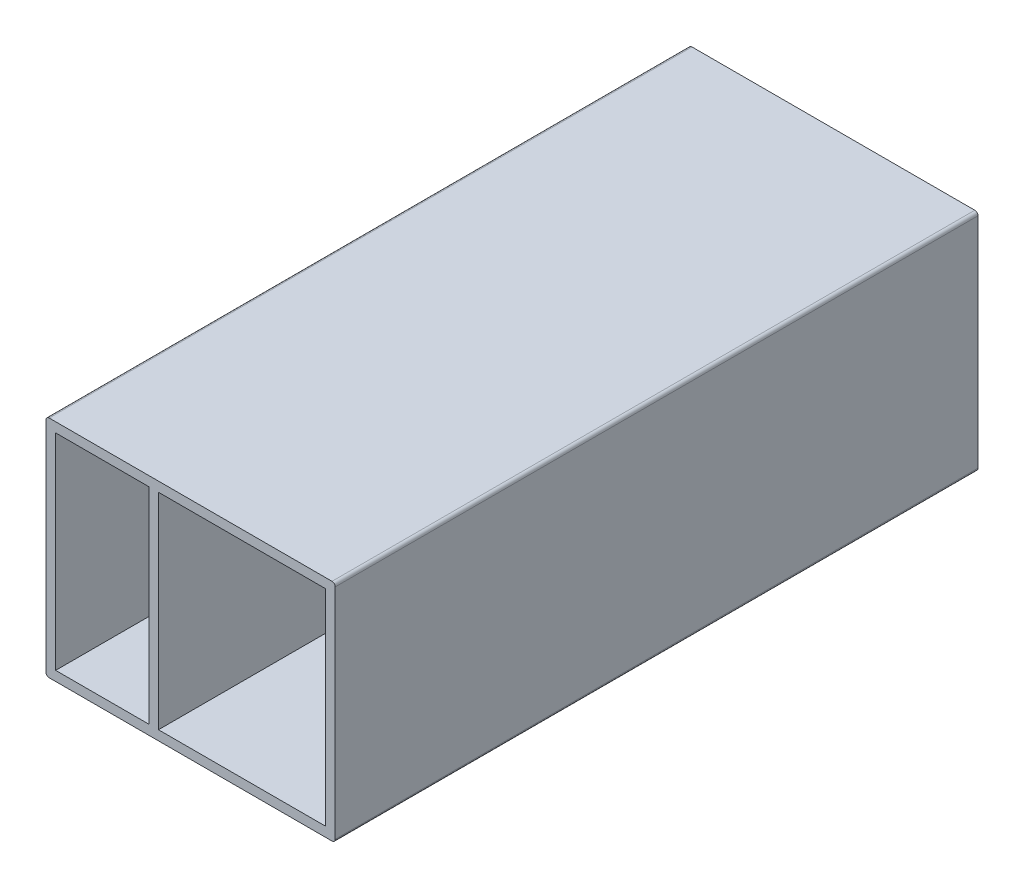
ISO-10303-21;
HEADER;
FILE_DESCRIPTION(('STEP AP214'),'2;1');
FILE_NAME('part.step','',(''),(''),'','','');
FILE_SCHEMA(('AUTOMOTIVE_DESIGN { 1 0 10303 214 1 1 1 1 }'));
ENDSEC;
DATA;
#1=APPLICATION_CONTEXT('core data for automotive mechanical design processes');
#2=APPLICATION_PROTOCOL_DEFINITION('international standard','automotive_design',2000,#1);
#3=PRODUCT_CONTEXT('',#1,'mechanical');
#4=PRODUCT('Part','Part','',(#3));
#5=PRODUCT_RELATED_PRODUCT_CATEGORY('part','',(#4));
#6=PRODUCT_DEFINITION_FORMATION('','',#4);
#7=PRODUCT_DEFINITION_CONTEXT('part definition',#1,'design');
#8=PRODUCT_DEFINITION('design','',#6,#7);
#9=PRODUCT_DEFINITION_SHAPE('','',#8);
#10=(LENGTH_UNIT() NAMED_UNIT(*) SI_UNIT(.MILLI.,.METRE.));
#11=(NAMED_UNIT(*) PLANE_ANGLE_UNIT() SI_UNIT($,.RADIAN.));
#12=(NAMED_UNIT(*) SI_UNIT($,.STERADIAN.) SOLID_ANGLE_UNIT());
#13=UNCERTAINTY_MEASURE_WITH_UNIT(LENGTH_MEASURE(1.E-05),#10,'distance_accuracy_value','');
#14=(GEOMETRIC_REPRESENTATION_CONTEXT(3) GLOBAL_UNCERTAINTY_ASSIGNED_CONTEXT((#13)) GLOBAL_UNIT_ASSIGNED_CONTEXT((#10,
#11,#12)) REPRESENTATION_CONTEXT('',''));
#15=CARTESIAN_POINT('',(0.,0.,0.));
#16=DIRECTION('',(0.,0.,1.));
#17=DIRECTION('',(1.,0.,0.));
#18=AXIS2_PLACEMENT_3D('',#15,#16,#17);
#19=CARTESIAN_POINT('',(0.,0.,200.));
#20=DIRECTION('',(0.,0.,-1.));
#21=DIRECTION('',(-1.,0.,0.));
#22=AXIS2_PLACEMENT_3D('',#19,#20,#21);
#23=PLANE('',#22);
#24=DIRECTION('',(-1.,0.,0.));
#25=VECTOR('',#24,1.);
#26=CARTESIAN_POINT('',(-10.,32.,200.));
#27=LINE('',#26,#25);
#28=CARTESIAN_POINT('',(42.,32.,200.));
#29=VERTEX_POINT('',#28);
#30=CARTESIAN_POINT('',(-10.,32.,200.));
#31=VERTEX_POINT('',#30);
#32=EDGE_CURVE('E315',#29,#31,#27,.T.);
#33=ORIENTED_EDGE('',*,*,#32,.F.);
#34=DIRECTION('',(0.,1.,0.));
#35=VECTOR('',#34,1.);
#36=CARTESIAN_POINT('',(42.,-32.,200.));
#37=LINE('',#36,#35);
#38=CARTESIAN_POINT('',(42.,-32.,200.));
#39=VERTEX_POINT('',#38);
#40=EDGE_CURVE('E323',#39,#29,#37,.T.);
#41=ORIENTED_EDGE('',*,*,#40,.F.);
#42=DIRECTION('',(1.,0.,0.));
#43=VECTOR('',#42,1.);
#44=CARTESIAN_POINT('',(-10.,-32.,200.));
#45=LINE('',#44,#43);
#46=CARTESIAN_POINT('',(-10.,-32.,200.));
#47=VERTEX_POINT('',#46);
#48=EDGE_CURVE('E320',#47,#39,#45,.T.);
#49=ORIENTED_EDGE('',*,*,#48,.F.);
#50=DIRECTION('',(0.,-1.,0.));
#51=VECTOR('',#50,1.);
#52=CARTESIAN_POINT('',(-10.,32.,200.));
#53=LINE('',#52,#51);
#54=EDGE_CURVE('E317',#31,#47,#53,.T.);
#55=ORIENTED_EDGE('',*,*,#54,.F.);
#56=EDGE_LOOP('',(#33,#41,#49,#55));
#57=FACE_BOUND('',#56,.T.);
#58=DIRECTION('',(0.,-1.,0.));
#59=VECTOR('',#58,1.);
#60=CARTESIAN_POINT('',(-45.,-35.,200.));
#61=LINE('',#60,#59);
#62=CARTESIAN_POINT('',(-45.,34.,200.));
#63=VERTEX_POINT('',#62);
#64=CARTESIAN_POINT('',(-45.,-34.,200.));
#65=VERTEX_POINT('',#64);
#66=EDGE_CURVE('E350',#63,#65,#61,.T.);
#67=ORIENTED_EDGE('',*,*,#66,.T.);
#68=CARTESIAN_POINT('',(-44.,-34.,200.));
#69=DIRECTION('',(0.,0.,-1.));
#70=DIRECTION('',(-1.,0.,0.));
#71=AXIS2_PLACEMENT_3D('',#68,#69,#70);
#72=CIRCLE('',#71,1.);
#73=CARTESIAN_POINT('',(-44.,-35.,200.));
#74=VERTEX_POINT('',#73);
#75=EDGE_CURVE('E235',#65,#74,#72,.F.);
#76=ORIENTED_EDGE('',*,*,#75,.T.);
#77=DIRECTION('',(1.,0.,0.));
#78=VECTOR('',#77,1.);
#79=CARTESIAN_POINT('',(-45.,-35.,200.));
#80=LINE('',#79,#78);
#81=CARTESIAN_POINT('',(44.,-35.,200.));
#82=VERTEX_POINT('',#81);
#83=EDGE_CURVE('E214',#74,#82,#80,.T.);
#84=ORIENTED_EDGE('',*,*,#83,.T.);
#85=CARTESIAN_POINT('',(44.,-34.,200.));
#86=DIRECTION('',(0.,0.,-1.));
#87=DIRECTION('',(-1.,0.,0.));
#88=AXIS2_PLACEMENT_3D('',#85,#86,#87);
#89=CIRCLE('',#88,1.);
#90=CARTESIAN_POINT('',(45.,-34.,200.));
#91=VERTEX_POINT('',#90);
#92=EDGE_CURVE('E233',#82,#91,#89,.F.);
#93=ORIENTED_EDGE('',*,*,#92,.T.);
#94=DIRECTION('',(0.,1.,0.));
#95=VECTOR('',#94,1.);
#96=CARTESIAN_POINT('',(45.,-35.,200.));
#97=LINE('',#96,#95);
#98=CARTESIAN_POINT('',(45.,34.,200.));
#99=VERTEX_POINT('',#98);
#100=EDGE_CURVE('E205',#91,#99,#97,.T.);
#101=ORIENTED_EDGE('',*,*,#100,.T.);
#102=CARTESIAN_POINT('',(44.,34.,200.));
#103=DIRECTION('',(0.,0.,-1.));
#104=DIRECTION('',(-1.,0.,0.));
#105=AXIS2_PLACEMENT_3D('',#102,#103,#104);
#106=CIRCLE('',#105,1.);
#107=CARTESIAN_POINT('',(44.,35.,200.));
#108=VERTEX_POINT('',#107);
#109=EDGE_CURVE('E231',#99,#108,#106,.F.);
#110=ORIENTED_EDGE('',*,*,#109,.T.);
#111=DIRECTION('',(-1.,0.,0.));
#112=VECTOR('',#111,1.);
#113=CARTESIAN_POINT('',(-45.,35.,200.));
#114=LINE('',#113,#112);
#115=CARTESIAN_POINT('',(-44.,35.,200.));
#116=VERTEX_POINT('',#115);
#117=EDGE_CURVE('E348',#108,#116,#114,.T.);
#118=ORIENTED_EDGE('',*,*,#117,.T.);
#119=CARTESIAN_POINT('',(-44.,34.,200.));
#120=DIRECTION('',(0.,0.,-1.));
#121=DIRECTION('',(-1.,0.,0.));
#122=AXIS2_PLACEMENT_3D('',#119,#120,#121);
#123=CIRCLE('',#122,1.);
#124=EDGE_CURVE('E229',#116,#63,#123,.F.);
#125=ORIENTED_EDGE('',*,*,#124,.T.);
#126=EDGE_LOOP('',(#67,#76,#84,#93,#101,#110,#118,#125));
#127=FACE_BOUND('',#126,.T.);
#128=DIRECTION('',(0.,-1.,0.));
#129=VECTOR('',#128,1.);
#130=CARTESIAN_POINT('',(-42.,-32.,200.));
#131=LINE('',#130,#129);
#132=CARTESIAN_POINT('',(-42.,32.,200.));
#133=VERTEX_POINT('',#132);
#134=CARTESIAN_POINT('',(-42.,-32.,200.));
#135=VERTEX_POINT('',#134);
#136=EDGE_CURVE('E288',#133,#135,#131,.T.);
#137=ORIENTED_EDGE('',*,*,#136,.F.);
#138=DIRECTION('',(-1.,0.,0.));
#139=VECTOR('',#138,1.);
#140=CARTESIAN_POINT('',(-42.,32.,200.));
#141=LINE('',#140,#139);
#142=CARTESIAN_POINT('',(-13.,32.,200.));
#143=VERTEX_POINT('',#142);
#144=EDGE_CURVE('E296',#143,#133,#141,.T.);
#145=ORIENTED_EDGE('',*,*,#144,.F.);
#146=DIRECTION('',(0.,1.,0.));
#147=VECTOR('',#146,1.);
#148=CARTESIAN_POINT('',(-13.,32.,200.));
#149=LINE('',#148,#147);
#150=CARTESIAN_POINT('',(-13.,-32.,200.));
#151=VERTEX_POINT('',#150);
#152=EDGE_CURVE('E293',#151,#143,#149,.T.);
#153=ORIENTED_EDGE('',*,*,#152,.F.);
#154=DIRECTION('',(1.,0.,0.));
#155=VECTOR('',#154,1.);
#156=CARTESIAN_POINT('',(-42.,-32.,200.));
#157=LINE('',#156,#155);
#158=EDGE_CURVE('E290',#135,#151,#157,.T.);
#159=ORIENTED_EDGE('',*,*,#158,.F.);
#160=EDGE_LOOP('',(#137,#145,#153,#159));
#161=FACE_BOUND('',#160,.T.);
#162=ADVANCED_FACE('F38',(#57,#127,#161),#23,.F.);
#163=CARTESIAN_POINT('',(0.,0.,0.));
#164=DIRECTION('',(0.,0.,-1.));
#165=DIRECTION('',(-1.,0.,0.));
#166=AXIS2_PLACEMENT_3D('',#163,#164,#165);
#167=PLANE('',#166);
#168=DIRECTION('',(1.,0.,0.));
#169=VECTOR('',#168,1.);
#170=CARTESIAN_POINT('',(-48.7120386195336,25.,0.));
#171=LINE('',#170,#169);
#172=CARTESIAN_POINT('',(-45.,25.,0.));
#173=VERTEX_POINT('',#172);
#174=CARTESIAN_POINT('',(-42.,25.,0.));
#175=VERTEX_POINT('',#174);
#176=EDGE_CURVE('E178',#173,#175,#171,.T.);
#177=ORIENTED_EDGE('',*,*,#176,.F.);
#178=DIRECTION('',(0.,-1.,0.));
#179=VECTOR('',#178,1.);
#180=CARTESIAN_POINT('',(-45.,-35.,0.));
#181=LINE('',#180,#179);
#182=CARTESIAN_POINT('',(-45.,34.,0.));
#183=VERTEX_POINT('',#182);
#184=EDGE_CURVE('E191',#183,#173,#181,.T.);
#185=ORIENTED_EDGE('',*,*,#184,.F.);
#186=CARTESIAN_POINT('',(-44.,34.,0.));
#187=DIRECTION('',(0.,0.,-1.));
#188=DIRECTION('',(-1.,0.,0.));
#189=AXIS2_PLACEMENT_3D('',#186,#187,#188);
#190=CIRCLE('',#189,1.);
#191=CARTESIAN_POINT('',(-44.,35.,0.));
#192=VERTEX_POINT('',#191);
#193=EDGE_CURVE('E217',#183,#192,#190,.T.);
#194=ORIENTED_EDGE('',*,*,#193,.T.);
#195=DIRECTION('',(-1.,0.,0.));
#196=VECTOR('',#195,1.);
#197=CARTESIAN_POINT('',(-45.,35.,0.));
#198=LINE('',#197,#196);
#199=CARTESIAN_POINT('',(44.,35.,0.));
#200=VERTEX_POINT('',#199);
#201=EDGE_CURVE('E207',#200,#192,#198,.T.);
#202=ORIENTED_EDGE('',*,*,#201,.F.);
#203=CARTESIAN_POINT('',(44.,34.,0.));
#204=DIRECTION('',(0.,0.,-1.));
#205=DIRECTION('',(-1.,0.,0.));
#206=AXIS2_PLACEMENT_3D('',#203,#204,#205);
#207=CIRCLE('',#206,1.);
#208=CARTESIAN_POINT('',(45.,34.,0.));
#209=VERTEX_POINT('',#208);
#210=EDGE_CURVE('E219',#200,#209,#207,.T.);
#211=ORIENTED_EDGE('',*,*,#210,.T.);
#212=DIRECTION('',(0.,1.,0.));
#213=VECTOR('',#212,1.);
#214=CARTESIAN_POINT('',(45.,-35.,0.));
#215=LINE('',#214,#213);
#216=CARTESIAN_POINT('',(45.,-34.,0.));
#217=VERTEX_POINT('',#216);
#218=EDGE_CURVE('E345',#217,#209,#215,.T.);
#219=ORIENTED_EDGE('',*,*,#218,.F.);
#220=CARTESIAN_POINT('',(44.,-34.,0.));
#221=DIRECTION('',(0.,0.,-1.));
#222=DIRECTION('',(-1.,0.,0.));
#223=AXIS2_PLACEMENT_3D('',#220,#221,#222);
#224=CIRCLE('',#223,1.);
#225=CARTESIAN_POINT('',(44.,-35.,0.));
#226=VERTEX_POINT('',#225);
#227=EDGE_CURVE('E221',#217,#226,#224,.T.);
#228=ORIENTED_EDGE('',*,*,#227,.T.);
#229=DIRECTION('',(1.,0.,0.));
#230=VECTOR('',#229,1.);
#231=CARTESIAN_POINT('',(-45.,-35.,0.));
#232=LINE('',#231,#230);
#233=CARTESIAN_POINT('',(-44.,-35.,0.));
#234=VERTEX_POINT('',#233);
#235=EDGE_CURVE('E201',#234,#226,#232,.T.);
#236=ORIENTED_EDGE('',*,*,#235,.F.);
#237=CARTESIAN_POINT('',(-44.,-34.,0.));
#238=DIRECTION('',(0.,0.,-1.));
#239=DIRECTION('',(-1.,0.,0.));
#240=AXIS2_PLACEMENT_3D('',#237,#238,#239);
#241=CIRCLE('',#240,1.);
#242=CARTESIAN_POINT('',(-45.,-34.,0.));
#243=VERTEX_POINT('',#242);
#244=EDGE_CURVE('E223',#234,#243,#241,.T.);
#245=ORIENTED_EDGE('',*,*,#244,.T.);
#246=CARTESIAN_POINT('',(-45.,-25.,0.));
#247=VERTEX_POINT('',#246);
#248=EDGE_CURVE('E202',#247,#243,#181,.T.);
#249=ORIENTED_EDGE('',*,*,#248,.F.);
#250=DIRECTION('',(1.,0.,0.));
#251=VECTOR('',#250,1.);
#252=CARTESIAN_POINT('',(-48.7120386195336,-25.,0.));
#253=LINE('',#252,#251);
#254=CARTESIAN_POINT('',(-42.,-25.,0.));
#255=VERTEX_POINT('',#254);
#256=EDGE_CURVE('E194',#247,#255,#253,.T.);
#257=ORIENTED_EDGE('',*,*,#256,.T.);
#258=DIRECTION('',(0.,-1.,0.));
#259=VECTOR('',#258,1.);
#260=CARTESIAN_POINT('',(-42.,-32.,0.));
#261=LINE('',#260,#259);
#262=CARTESIAN_POINT('',(-42.,-32.,0.));
#263=VERTEX_POINT('',#262);
#264=EDGE_CURVE('E253',#255,#263,#261,.T.);
#265=ORIENTED_EDGE('',*,*,#264,.T.);
#266=DIRECTION('',(1.,0.,0.));
#267=VECTOR('',#266,1.);
#268=CARTESIAN_POINT('',(-42.,-32.,0.));
#269=LINE('',#268,#267);
#270=CARTESIAN_POINT('',(-13.,-32.,0.));
#271=VERTEX_POINT('',#270);
#272=EDGE_CURVE('E300',#263,#271,#269,.T.);
#273=ORIENTED_EDGE('',*,*,#272,.T.);
#274=DIRECTION('',(0.,1.,0.));
#275=VECTOR('',#274,1.);
#276=CARTESIAN_POINT('',(-13.,32.,0.));
#277=LINE('',#276,#275);
#278=CARTESIAN_POINT('',(-13.,32.,0.));
#279=VERTEX_POINT('',#278);
#280=EDGE_CURVE('E302',#271,#279,#277,.T.);
#281=ORIENTED_EDGE('',*,*,#280,.T.);
#282=DIRECTION('',(-1.,0.,0.));
#283=VECTOR('',#282,1.);
#284=CARTESIAN_POINT('',(-42.,32.,0.));
#285=LINE('',#284,#283);
#286=CARTESIAN_POINT('',(-42.,32.,0.));
#287=VERTEX_POINT('',#286);
#288=EDGE_CURVE('E291',#279,#287,#285,.T.);
#289=ORIENTED_EDGE('',*,*,#288,.T.);
#290=EDGE_CURVE('E193',#287,#175,#261,.T.);
#291=ORIENTED_EDGE('',*,*,#290,.T.);
#292=EDGE_LOOP('',(#177,#185,#194,#202,#211,#219,#228,#236,#245,#249,#257,#265,#273,#281,#289,#291));
#293=FACE_BOUND('',#292,.T.);
#294=DIRECTION('',(0.,1.,0.));
#295=VECTOR('',#294,1.);
#296=CARTESIAN_POINT('',(42.,-32.,0.));
#297=LINE('',#296,#295);
#298=CARTESIAN_POINT('',(42.,-32.,0.));
#299=VERTEX_POINT('',#298);
#300=CARTESIAN_POINT('',(42.,32.,0.));
#301=VERTEX_POINT('',#300);
#302=EDGE_CURVE('E318',#299,#301,#297,.T.);
#303=ORIENTED_EDGE('',*,*,#302,.T.);
#304=DIRECTION('',(-1.,0.,0.));
#305=VECTOR('',#304,1.);
#306=CARTESIAN_POINT('',(-10.,32.,0.));
#307=LINE('',#306,#305);
#308=CARTESIAN_POINT('',(-10.,32.,0.));
#309=VERTEX_POINT('',#308);
#310=EDGE_CURVE('E314',#301,#309,#307,.T.);
#311=ORIENTED_EDGE('',*,*,#310,.T.);
#312=DIRECTION('',(0.,-1.,0.));
#313=VECTOR('',#312,1.);
#314=CARTESIAN_POINT('',(-10.,32.,0.));
#315=LINE('',#314,#313);
#316=CARTESIAN_POINT('',(-10.,-32.,0.));
#317=VERTEX_POINT('',#316);
#318=EDGE_CURVE('E328',#309,#317,#315,.T.);
#319=ORIENTED_EDGE('',*,*,#318,.T.);
#320=DIRECTION('',(1.,0.,0.));
#321=VECTOR('',#320,1.);
#322=CARTESIAN_POINT('',(-10.,-32.,0.));
#323=LINE('',#322,#321);
#324=EDGE_CURVE('E331',#317,#299,#323,.T.);
#325=ORIENTED_EDGE('',*,*,#324,.T.);
#326=EDGE_LOOP('',(#303,#311,#319,#325));
#327=FACE_BOUND('',#326,.T.);
#328=ADVANCED_FACE('F189',(#293,#327),#167,.T.);
#329=CARTESIAN_POINT('',(45.,-35.,200.));
#330=DIRECTION('',(-1.,0.,0.));
#331=DIRECTION('',(0.,0.,1.));
#332=AXIS2_PLACEMENT_3D('',#329,#330,#331);
#333=PLANE('',#332);
#334=ORIENTED_EDGE('',*,*,#100,.F.);
#335=DIRECTION('',(0.,0.,-1.));
#336=VECTOR('',#335,1.);
#337=CARTESIAN_POINT('',(45.,-34.,200.));
#338=LINE('',#337,#336);
#339=EDGE_CURVE('E239',#91,#217,#338,.T.);
#340=ORIENTED_EDGE('',*,*,#339,.T.);
#341=ORIENTED_EDGE('',*,*,#218,.T.);
#342=DIRECTION('',(0.,0.,-1.));
#343=VECTOR('',#342,1.);
#344=CARTESIAN_POINT('',(45.,34.,200.));
#345=LINE('',#344,#343);
#346=EDGE_CURVE('E237',#209,#99,#345,.F.);
#347=ORIENTED_EDGE('',*,*,#346,.T.);
#348=EDGE_LOOP('',(#334,#340,#341,#347));
#349=FACE_BOUND('',#348,.T.);
#350=ADVANCED_FACE('F381',(#349),#333,.F.);
#351=CARTESIAN_POINT('',(-45.,35.,200.));
#352=DIRECTION('',(0.,-1.,0.));
#353=DIRECTION('',(0.,0.,-1.));
#354=AXIS2_PLACEMENT_3D('',#351,#352,#353);
#355=PLANE('',#354);
#356=ORIENTED_EDGE('',*,*,#117,.F.);
#357=DIRECTION('',(0.,0.,-1.));
#358=VECTOR('',#357,1.);
#359=CARTESIAN_POINT('',(44.,35.,200.));
#360=LINE('',#359,#358);
#361=EDGE_CURVE('E243',#108,#200,#360,.T.);
#362=ORIENTED_EDGE('',*,*,#361,.T.);
#363=ORIENTED_EDGE('',*,*,#201,.T.);
#364=DIRECTION('',(0.,0.,-1.));
#365=VECTOR('',#364,1.);
#366=CARTESIAN_POINT('',(-44.,35.,200.));
#367=LINE('',#366,#365);
#368=EDGE_CURVE('E60',#192,#116,#367,.F.);
#369=ORIENTED_EDGE('',*,*,#368,.T.);
#370=EDGE_LOOP('',(#356,#362,#363,#369));
#371=FACE_BOUND('',#370,.T.);
#372=ADVANCED_FACE('F359',(#371),#355,.F.);
#373=CARTESIAN_POINT('',(-45.,-35.,200.));
#374=DIRECTION('',(1.,0.,0.));
#375=DIRECTION('',(0.,0.,-1.));
#376=AXIS2_PLACEMENT_3D('',#373,#374,#375);
#377=PLANE('',#376);
#378=ORIENTED_EDGE('',*,*,#184,.T.);
#379=DIRECTION('',(0.,0.,1.));
#380=VECTOR('',#379,1.);
#381=CARTESIAN_POINT('',(-45.,25.,200.));
#382=LINE('',#381,#380);
#383=CARTESIAN_POINT('',(-45.,25.,5.));
#384=VERTEX_POINT('',#383);
#385=EDGE_CURVE('E175',#173,#384,#382,.T.);
#386=ORIENTED_EDGE('',*,*,#385,.T.);
#387=DIRECTION('',(0.,1.,0.));
#388=VECTOR('',#387,1.);
#389=CARTESIAN_POINT('',(-45.,-35.,5.));
#390=LINE('',#389,#388);
#391=CARTESIAN_POINT('',(-45.,-25.,5.));
#392=VERTEX_POINT('',#391);
#393=EDGE_CURVE('E268',#392,#384,#390,.T.);
#394=ORIENTED_EDGE('',*,*,#393,.F.);
#395=DIRECTION('',(0.,0.,1.));
#396=VECTOR('',#395,1.);
#397=CARTESIAN_POINT('',(-45.,-25.,200.));
#398=LINE('',#397,#396);
#399=EDGE_CURVE('E184',#247,#392,#398,.T.);
#400=ORIENTED_EDGE('',*,*,#399,.F.);
#401=ORIENTED_EDGE('',*,*,#248,.T.);
#402=DIRECTION('',(0.,0.,-1.));
#403=VECTOR('',#402,1.);
#404=CARTESIAN_POINT('',(-45.,-34.,200.));
#405=LINE('',#404,#403);
#406=EDGE_CURVE('E227',#243,#65,#405,.F.);
#407=ORIENTED_EDGE('',*,*,#406,.T.);
#408=ORIENTED_EDGE('',*,*,#66,.F.);
#409=DIRECTION('',(0.,0.,-1.));
#410=VECTOR('',#409,1.);
#411=CARTESIAN_POINT('',(-45.,34.,200.));
#412=LINE('',#411,#410);
#413=EDGE_CURVE('E200',#63,#183,#412,.T.);
#414=ORIENTED_EDGE('',*,*,#413,.T.);
#415=EDGE_LOOP('',(#378,#386,#394,#400,#401,#407,#408,#414));
#416=FACE_BOUND('',#415,.T.);
#417=ADVANCED_FACE('F197',(#416),#377,.F.);
#418=CARTESIAN_POINT('',(-45.,-35.,200.));
#419=DIRECTION('',(0.,1.,0.));
#420=DIRECTION('',(0.,0.,1.));
#421=AXIS2_PLACEMENT_3D('',#418,#419,#420);
#422=PLANE('',#421);
#423=ORIENTED_EDGE('',*,*,#83,.F.);
#424=DIRECTION('',(0.,0.,-1.));
#425=VECTOR('',#424,1.);
#426=CARTESIAN_POINT('',(-44.,-35.,200.));
#427=LINE('',#426,#425);
#428=EDGE_CURVE('E213',#74,#234,#427,.T.);
#429=ORIENTED_EDGE('',*,*,#428,.T.);
#430=ORIENTED_EDGE('',*,*,#235,.T.);
#431=DIRECTION('',(0.,0.,-1.));
#432=VECTOR('',#431,1.);
#433=CARTESIAN_POINT('',(44.,-35.,200.));
#434=LINE('',#433,#432);
#435=EDGE_CURVE('E211',#226,#82,#434,.F.);
#436=ORIENTED_EDGE('',*,*,#435,.T.);
#437=EDGE_LOOP('',(#423,#429,#430,#436));
#438=FACE_BOUND('',#437,.T.);
#439=ADVANCED_FACE('F373',(#438),#422,.F.);
#440=CARTESIAN_POINT('',(-10.,32.,200.));
#441=DIRECTION('',(0.,-1.,0.));
#442=DIRECTION('',(0.,0.,-1.));
#443=AXIS2_PLACEMENT_3D('',#440,#441,#442);
#444=PLANE('',#443);
#445=ORIENTED_EDGE('',*,*,#310,.F.);
#446=DIRECTION('',(0.,0.,-1.));
#447=VECTOR('',#446,1.);
#448=CARTESIAN_POINT('',(42.,32.,200.));
#449=LINE('',#448,#447);
#450=EDGE_CURVE('E325',#29,#301,#449,.T.);
#451=ORIENTED_EDGE('',*,*,#450,.F.);
#452=ORIENTED_EDGE('',*,*,#32,.T.);
#453=DIRECTION('',(0.,0.,-1.));
#454=VECTOR('',#453,1.);
#455=CARTESIAN_POINT('',(-10.,32.,200.));
#456=LINE('',#455,#454);
#457=EDGE_CURVE('E342',#31,#309,#456,.T.);
#458=ORIENTED_EDGE('',*,*,#457,.T.);
#459=EDGE_LOOP('',(#445,#451,#452,#458));
#460=FACE_BOUND('',#459,.T.);
#461=ADVANCED_FACE('F400',(#460),#444,.T.);
#462=CARTESIAN_POINT('',(-10.,32.,200.));
#463=DIRECTION('',(1.,0.,0.));
#464=DIRECTION('',(0.,1.,0.));
#465=AXIS2_PLACEMENT_3D('',#462,#463,#464);
#466=PLANE('',#465);
#467=CARTESIAN_POINT('',(-10.,0.,100.));
#468=DIRECTION('',(1.,0.,0.));
#469=DIRECTION('',(0.,1.,0.));
#470=AXIS2_PLACEMENT_3D('',#467,#468,#469);
#471=CIRCLE('',#470,4.75);
#472=CARTESIAN_POINT('',(-10.,4.75,100.));
#473=VERTEX_POINT('',#472);
#474=EDGE_CURVE('E274',#473,#473,#471,.T.);
#475=ORIENTED_EDGE('',*,*,#474,.F.);
#476=EDGE_LOOP('',(#475));
#477=FACE_BOUND('',#476,.T.);
#478=CARTESIAN_POINT('',(-10.,19.6938146096122,92.));
#479=DIRECTION('',(1.,0.,0.));
#480=DIRECTION('',(0.,1.,0.));
#481=AXIS2_PLACEMENT_3D('',#478,#479,#480);
#482=CIRCLE('',#481,2.);
#483=CARTESIAN_POINT('',(-10.,21.6938146096122,92.));
#484=VERTEX_POINT('',#483);
#485=EDGE_CURVE('E280',#484,#484,#482,.T.);
#486=ORIENTED_EDGE('',*,*,#485,.F.);
#487=EDGE_LOOP('',(#486));
#488=FACE_BOUND('',#487,.T.);
#489=CARTESIAN_POINT('',(-10.,-16.8976674811876,92.));
#490=DIRECTION('',(1.,0.,0.));
#491=DIRECTION('',(0.,1.,0.));
#492=AXIS2_PLACEMENT_3D('',#489,#490,#491);
#493=CIRCLE('',#492,2.);
#494=CARTESIAN_POINT('',(-10.,-14.8976674811876,92.));
#495=VERTEX_POINT('',#494);
#496=EDGE_CURVE('E183',#495,#495,#493,.T.);
#497=ORIENTED_EDGE('',*,*,#496,.F.);
#498=EDGE_LOOP('',(#497));
#499=FACE_BOUND('',#498,.T.);
#500=ORIENTED_EDGE('',*,*,#318,.F.);
#501=ORIENTED_EDGE('',*,*,#457,.F.);
#502=ORIENTED_EDGE('',*,*,#54,.T.);
#503=DIRECTION('',(0.,0.,-1.));
#504=VECTOR('',#503,1.);
#505=CARTESIAN_POINT('',(-10.,-32.,200.));
#506=LINE('',#505,#504);
#507=EDGE_CURVE('E340',#47,#317,#506,.T.);
#508=ORIENTED_EDGE('',*,*,#507,.T.);
#509=EDGE_LOOP('',(#500,#501,#502,#508));
#510=FACE_BOUND('',#509,.T.);
#511=ADVANCED_FACE('F440',(#477,#488,#499,#510),#466,.T.);
#512=CARTESIAN_POINT('',(-10.,-32.,200.));
#513=DIRECTION('',(0.,1.,0.));
#514=DIRECTION('',(0.,0.,1.));
#515=AXIS2_PLACEMENT_3D('',#512,#513,#514);
#516=PLANE('',#515);
#517=ORIENTED_EDGE('',*,*,#324,.F.);
#518=ORIENTED_EDGE('',*,*,#507,.F.);
#519=ORIENTED_EDGE('',*,*,#48,.T.);
#520=DIRECTION('',(0.,0.,-1.));
#521=VECTOR('',#520,1.);
#522=CARTESIAN_POINT('',(42.,-32.,200.));
#523=LINE('',#522,#521);
#524=EDGE_CURVE('E338',#39,#299,#523,.T.);
#525=ORIENTED_EDGE('',*,*,#524,.T.);
#526=EDGE_LOOP('',(#517,#518,#519,#525));
#527=FACE_BOUND('',#526,.T.);
#528=ADVANCED_FACE('F437',(#527),#516,.T.);
#529=CARTESIAN_POINT('',(42.,-32.,200.));
#530=DIRECTION('',(-1.,0.,0.));
#531=DIRECTION('',(0.,-1.,0.));
#532=AXIS2_PLACEMENT_3D('',#529,#530,#531);
#533=PLANE('',#532);
#534=ORIENTED_EDGE('',*,*,#302,.F.);
#535=ORIENTED_EDGE('',*,*,#524,.F.);
#536=ORIENTED_EDGE('',*,*,#40,.T.);
#537=ORIENTED_EDGE('',*,*,#450,.T.);
#538=EDGE_LOOP('',(#534,#535,#536,#537));
#539=FACE_BOUND('',#538,.T.);
#540=ADVANCED_FACE('F434',(#539),#533,.T.);
#541=CARTESIAN_POINT('',(-42.,-32.,200.));
#542=DIRECTION('',(1.,0.,0.));
#543=DIRECTION('',(0.,1.,0.));
#544=AXIS2_PLACEMENT_3D('',#541,#542,#543);
#545=PLANE('',#544);
#546=DIRECTION('',(0.,0.,1.));
#547=VECTOR('',#546,1.);
#548=CARTESIAN_POINT('',(-42.,25.,200.));
#549=LINE('',#548,#547);
#550=CARTESIAN_POINT('',(-42.,25.,5.));
#551=VERTEX_POINT('',#550);
#552=EDGE_CURVE('E11',#175,#551,#549,.T.);
#553=ORIENTED_EDGE('',*,*,#552,.F.);
#554=ORIENTED_EDGE('',*,*,#290,.F.);
#555=DIRECTION('',(0.,0.,-1.));
#556=VECTOR('',#555,1.);
#557=CARTESIAN_POINT('',(-42.,32.,200.));
#558=LINE('',#557,#556);
#559=EDGE_CURVE('E298',#133,#287,#558,.T.);
#560=ORIENTED_EDGE('',*,*,#559,.F.);
#561=ORIENTED_EDGE('',*,*,#136,.T.);
#562=DIRECTION('',(0.,0.,-1.));
#563=VECTOR('',#562,1.);
#564=CARTESIAN_POINT('',(-42.,-32.,200.));
#565=LINE('',#564,#563);
#566=EDGE_CURVE('E312',#135,#263,#565,.T.);
#567=ORIENTED_EDGE('',*,*,#566,.T.);
#568=ORIENTED_EDGE('',*,*,#264,.F.);
#569=DIRECTION('',(0.,0.,1.));
#570=VECTOR('',#569,1.);
#571=CARTESIAN_POINT('',(-42.,-25.,200.));
#572=LINE('',#571,#570);
#573=CARTESIAN_POINT('',(-42.,-25.,5.));
#574=VERTEX_POINT('',#573);
#575=EDGE_CURVE('E46',#255,#574,#572,.T.);
#576=ORIENTED_EDGE('',*,*,#575,.T.);
#577=DIRECTION('',(0.,1.,0.));
#578=VECTOR('',#577,1.);
#579=CARTESIAN_POINT('',(-42.,-32.,5.));
#580=LINE('',#579,#578);
#581=EDGE_CURVE('E246',#574,#551,#580,.T.);
#582=ORIENTED_EDGE('',*,*,#581,.T.);
#583=EDGE_LOOP('',(#553,#554,#560,#561,#567,#568,#576,#582));
#584=FACE_BOUND('',#583,.T.);
#585=ADVANCED_FACE('F251',(#584),#545,.T.);
#586=CARTESIAN_POINT('',(-42.,-32.,200.));
#587=DIRECTION('',(0.,1.,0.));
#588=DIRECTION('',(0.,0.,1.));
#589=AXIS2_PLACEMENT_3D('',#586,#587,#588);
#590=PLANE('',#589);
#591=ORIENTED_EDGE('',*,*,#272,.F.);
#592=ORIENTED_EDGE('',*,*,#566,.F.);
#593=ORIENTED_EDGE('',*,*,#158,.T.);
#594=DIRECTION('',(0.,0.,-1.));
#595=VECTOR('',#594,1.);
#596=CARTESIAN_POINT('',(-13.,-32.,200.));
#597=LINE('',#596,#595);
#598=EDGE_CURVE('E310',#151,#271,#597,.T.);
#599=ORIENTED_EDGE('',*,*,#598,.T.);
#600=EDGE_LOOP('',(#591,#592,#593,#599));
#601=FACE_BOUND('',#600,.T.);
#602=ADVANCED_FACE('F422',(#601),#590,.T.);
#603=CARTESIAN_POINT('',(-13.,32.,200.));
#604=DIRECTION('',(-1.,0.,0.));
#605=DIRECTION('',(0.,0.,1.));
#606=AXIS2_PLACEMENT_3D('',#603,#604,#605);
#607=PLANE('',#606);
#608=CARTESIAN_POINT('',(-13.,0.,100.));
#609=DIRECTION('',(1.,0.,0.));
#610=DIRECTION('',(0.,1.,0.));
#611=AXIS2_PLACEMENT_3D('',#608,#609,#610);
#612=CIRCLE('',#611,4.75);
#613=CARTESIAN_POINT('',(-13.,4.75,100.));
#614=VERTEX_POINT('',#613);
#615=EDGE_CURVE('E271',#614,#614,#612,.T.);
#616=ORIENTED_EDGE('',*,*,#615,.T.);
#617=EDGE_LOOP('',(#616));
#618=FACE_BOUND('',#617,.T.);
#619=CARTESIAN_POINT('',(-13.,19.6938146096122,92.));
#620=DIRECTION('',(1.,0.,0.));
#621=DIRECTION('',(0.,1.,0.));
#622=AXIS2_PLACEMENT_3D('',#619,#620,#621);
#623=CIRCLE('',#622,2.);
#624=CARTESIAN_POINT('',(-13.,21.6938146096122,92.));
#625=VERTEX_POINT('',#624);
#626=EDGE_CURVE('E277',#625,#625,#623,.T.);
#627=ORIENTED_EDGE('',*,*,#626,.T.);
#628=EDGE_LOOP('',(#627));
#629=FACE_BOUND('',#628,.T.);
#630=CARTESIAN_POINT('',(-13.,-16.8976674811876,92.));
#631=DIRECTION('',(1.,0.,0.));
#632=DIRECTION('',(0.,1.,0.));
#633=AXIS2_PLACEMENT_3D('',#630,#631,#632);
#634=CIRCLE('',#633,2.);
#635=CARTESIAN_POINT('',(-13.,-14.8976674811876,92.));
#636=VERTEX_POINT('',#635);
#637=EDGE_CURVE('E283',#636,#636,#634,.T.);
#638=ORIENTED_EDGE('',*,*,#637,.T.);
#639=EDGE_LOOP('',(#638));
#640=FACE_BOUND('',#639,.T.);
#641=ORIENTED_EDGE('',*,*,#280,.F.);
#642=ORIENTED_EDGE('',*,*,#598,.F.);
#643=ORIENTED_EDGE('',*,*,#152,.T.);
#644=DIRECTION('',(0.,0.,-1.));
#645=VECTOR('',#644,1.);
#646=CARTESIAN_POINT('',(-13.,32.,200.));
#647=LINE('',#646,#645);
#648=EDGE_CURVE('E308',#143,#279,#647,.T.);
#649=ORIENTED_EDGE('',*,*,#648,.T.);
#650=EDGE_LOOP('',(#641,#642,#643,#649));
#651=FACE_BOUND('',#650,.T.);
#652=ADVANCED_FACE('F416',(#618,#629,#640,#651),#607,.T.);
#653=CARTESIAN_POINT('',(-42.,32.,200.));
#654=DIRECTION('',(0.,-1.,0.));
#655=DIRECTION('',(0.,0.,-1.));
#656=AXIS2_PLACEMENT_3D('',#653,#654,#655);
#657=PLANE('',#656);
#658=ORIENTED_EDGE('',*,*,#288,.F.);
#659=ORIENTED_EDGE('',*,*,#648,.F.);
#660=ORIENTED_EDGE('',*,*,#144,.T.);
#661=ORIENTED_EDGE('',*,*,#559,.T.);
#662=EDGE_LOOP('',(#658,#659,#660,#661));
#663=FACE_BOUND('',#662,.T.);
#664=ADVANCED_FACE('F412',(#663),#657,.T.);
#665=CARTESIAN_POINT('',(-44.,-34.,200.));
#666=DIRECTION('',(0.,0.,-1.));
#667=DIRECTION('',(-1.,0.,0.));
#668=AXIS2_PLACEMENT_3D('',#665,#666,#667);
#669=CYLINDRICAL_SURFACE('',#668,1.);
#670=ORIENTED_EDGE('',*,*,#75,.F.);
#671=ORIENTED_EDGE('',*,*,#406,.F.);
#672=ORIENTED_EDGE('',*,*,#244,.F.);
#673=ORIENTED_EDGE('',*,*,#428,.F.);
#674=EDGE_LOOP('',(#670,#671,#672,#673));
#675=FACE_BOUND('',#674,.T.);
#676=ADVANCED_FACE('F368',(#675),#669,.T.);
#677=CARTESIAN_POINT('',(44.,-34.,200.));
#678=DIRECTION('',(0.,0.,-1.));
#679=DIRECTION('',(-1.,0.,0.));
#680=AXIS2_PLACEMENT_3D('',#677,#678,#679);
#681=CYLINDRICAL_SURFACE('',#680,1.);
#682=ORIENTED_EDGE('',*,*,#92,.F.);
#683=ORIENTED_EDGE('',*,*,#435,.F.);
#684=ORIENTED_EDGE('',*,*,#227,.F.);
#685=ORIENTED_EDGE('',*,*,#339,.F.);
#686=EDGE_LOOP('',(#682,#683,#684,#685));
#687=FACE_BOUND('',#686,.T.);
#688=ADVANCED_FACE('F377',(#687),#681,.T.);
#689=CARTESIAN_POINT('',(44.,34.,200.));
#690=DIRECTION('',(0.,0.,-1.));
#691=DIRECTION('',(-1.,0.,0.));
#692=AXIS2_PLACEMENT_3D('',#689,#690,#691);
#693=CYLINDRICAL_SURFACE('',#692,1.);
#694=ORIENTED_EDGE('',*,*,#109,.F.);
#695=ORIENTED_EDGE('',*,*,#346,.F.);
#696=ORIENTED_EDGE('',*,*,#210,.F.);
#697=ORIENTED_EDGE('',*,*,#361,.F.);
#698=EDGE_LOOP('',(#694,#695,#696,#697));
#699=FACE_BOUND('',#698,.T.);
#700=ADVANCED_FACE('F383',(#699),#693,.T.);
#701=CARTESIAN_POINT('',(-44.,34.,200.));
#702=DIRECTION('',(0.,0.,-1.));
#703=DIRECTION('',(-1.,0.,0.));
#704=AXIS2_PLACEMENT_3D('',#701,#702,#703);
#705=CYLINDRICAL_SURFACE('',#704,1.);
#706=ORIENTED_EDGE('',*,*,#124,.F.);
#707=ORIENTED_EDGE('',*,*,#368,.F.);
#708=ORIENTED_EDGE('',*,*,#193,.F.);
#709=ORIENTED_EDGE('',*,*,#413,.F.);
#710=EDGE_LOOP('',(#706,#707,#708,#709));
#711=FACE_BOUND('',#710,.T.);
#712=ADVANCED_FACE('F40',(#711),#705,.T.);
#713=CARTESIAN_POINT('',(-13.,-16.8976674811876,92.));
#714=DIRECTION('',(1.,0.,0.));
#715=DIRECTION('',(0.,1.,0.));
#716=AXIS2_PLACEMENT_3D('',#713,#714,#715);
#717=CYLINDRICAL_SURFACE('',#716,2.);
#718=ORIENTED_EDGE('',*,*,#637,.F.);
#719=EDGE_LOOP('',(#718));
#720=FACE_BOUND('',#719,.T.);
#721=ORIENTED_EDGE('',*,*,#496,.T.);
#722=EDGE_LOOP('',(#721));
#723=FACE_BOUND('',#722,.T.);
#724=ADVANCED_FACE('F389',(#720,#723),#717,.F.);
#725=CARTESIAN_POINT('',(-13.,19.6938146096122,92.));
#726=DIRECTION('',(1.,0.,0.));
#727=DIRECTION('',(0.,1.,0.));
#728=AXIS2_PLACEMENT_3D('',#725,#726,#727);
#729=CYLINDRICAL_SURFACE('',#728,2.);
#730=ORIENTED_EDGE('',*,*,#626,.F.);
#731=EDGE_LOOP('',(#730));
#732=FACE_BOUND('',#731,.T.);
#733=ORIENTED_EDGE('',*,*,#485,.T.);
#734=EDGE_LOOP('',(#733));
#735=FACE_BOUND('',#734,.T.);
#736=ADVANCED_FACE('F464',(#732,#735),#729,.F.);
#737=CARTESIAN_POINT('',(-13.,0.,100.));
#738=DIRECTION('',(1.,0.,0.));
#739=DIRECTION('',(0.,1.,0.));
#740=AXIS2_PLACEMENT_3D('',#737,#738,#739);
#741=CYLINDRICAL_SURFACE('',#740,4.75);
#742=ORIENTED_EDGE('',*,*,#615,.F.);
#743=EDGE_LOOP('',(#742));
#744=FACE_BOUND('',#743,.T.);
#745=ORIENTED_EDGE('',*,*,#474,.T.);
#746=EDGE_LOOP('',(#745));
#747=FACE_BOUND('',#746,.T.);
#748=ADVANCED_FACE('F469',(#744,#747),#741,.F.);
#749=CARTESIAN_POINT('',(-48.7120386195336,25.,5.));
#750=DIRECTION('',(0.,1.,0.));
#751=DIRECTION('',(0.,0.,1.));
#752=AXIS2_PLACEMENT_3D('',#749,#750,#751);
#753=PLANE('',#752);
#754=ORIENTED_EDGE('',*,*,#176,.T.);
#755=ORIENTED_EDGE('',*,*,#552,.T.);
#756=DIRECTION('',(1.,0.,0.));
#757=VECTOR('',#756,1.);
#758=CARTESIAN_POINT('',(-48.7120386195336,25.,5.));
#759=LINE('',#758,#757);
#760=EDGE_CURVE('E53',#384,#551,#759,.T.);
#761=ORIENTED_EDGE('',*,*,#760,.F.);
#762=ORIENTED_EDGE('',*,*,#385,.F.);
#763=EDGE_LOOP('',(#754,#755,#761,#762));
#764=FACE_BOUND('',#763,.T.);
#765=ADVANCED_FACE('F177',(#764),#753,.F.);
#766=CARTESIAN_POINT('',(-48.7120386195336,-25.,5.));
#767=DIRECTION('',(0.,1.,0.));
#768=DIRECTION('',(0.,0.,1.));
#769=AXIS2_PLACEMENT_3D('',#766,#767,#768);
#770=PLANE('',#769);
#771=ORIENTED_EDGE('',*,*,#399,.T.);
#772=DIRECTION('',(1.,0.,0.));
#773=VECTOR('',#772,1.);
#774=CARTESIAN_POINT('',(-48.7120386195336,-25.,5.));
#775=LINE('',#774,#773);
#776=EDGE_CURVE('E260',#392,#574,#775,.T.);
#777=ORIENTED_EDGE('',*,*,#776,.T.);
#778=ORIENTED_EDGE('',*,*,#575,.F.);
#779=ORIENTED_EDGE('',*,*,#256,.F.);
#780=EDGE_LOOP('',(#771,#777,#778,#779));
#781=FACE_BOUND('',#780,.T.);
#782=ADVANCED_FACE('F257',(#781),#770,.T.);
#783=CARTESIAN_POINT('',(0.,0.,5.));
#784=DIRECTION('',(0.,0.,-1.));
#785=DIRECTION('',(-1.,0.,0.));
#786=AXIS2_PLACEMENT_3D('',#783,#784,#785);
#787=PLANE('',#786);
#788=ORIENTED_EDGE('',*,*,#393,.T.);
#789=ORIENTED_EDGE('',*,*,#760,.T.);
#790=ORIENTED_EDGE('',*,*,#581,.F.);
#791=ORIENTED_EDGE('',*,*,#776,.F.);
#792=EDGE_LOOP('',(#788,#789,#790,#791));
#793=FACE_BOUND('',#792,.T.);
#794=ADVANCED_FACE('F494',(#793),#787,.T.);
#795=CLOSED_SHELL('',(#162,#328,#350,#372,#417,#439,#461,#511,#528,#540,#585,#602,#652,#664,
#676,#688,#700,#712,#724,#736,#748,#765,#782,#794));
#796=MANIFOLD_SOLID_BREP('B2',#795);
#797=ADVANCED_BREP_SHAPE_REPRESENTATION('',(#18,#796),#14);
#798=SHAPE_DEFINITION_REPRESENTATION(#9,#797);
ENDSEC;
END-ISO-10303-21;
